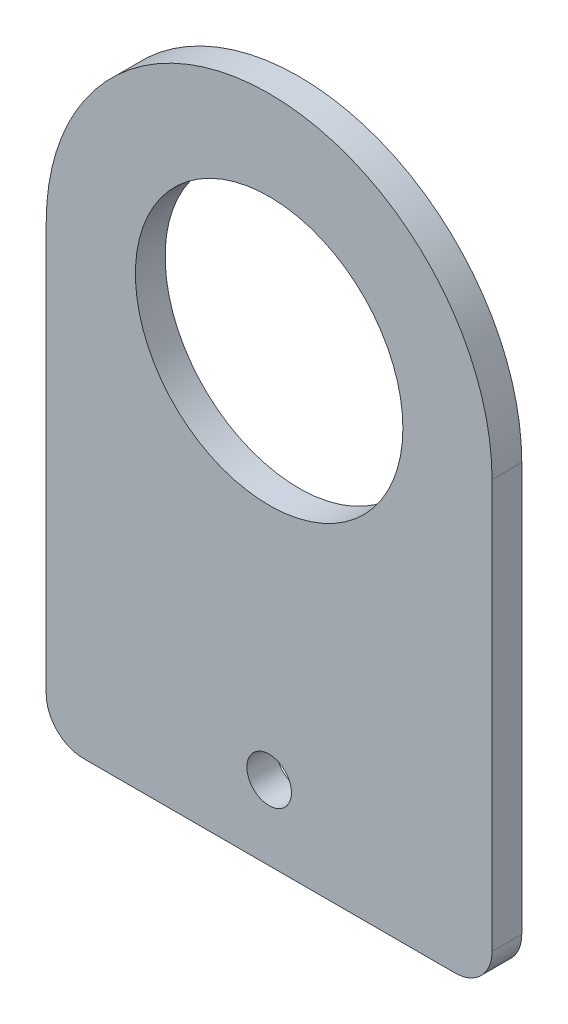
ISO-10303-21;
HEADER;
FILE_DESCRIPTION(('STEP AP214'),'2;1');
FILE_NAME('part.step','',(''),(''),'','','');
FILE_SCHEMA(('AUTOMOTIVE_DESIGN { 1 0 10303 214 1 1 1 1 }'));
ENDSEC;
DATA;
#1=APPLICATION_CONTEXT('core data for automotive mechanical design processes');
#2=APPLICATION_PROTOCOL_DEFINITION('international standard','automotive_design',2000,#1);
#3=PRODUCT_CONTEXT('',#1,'mechanical');
#4=PRODUCT('Part','Part','',(#3));
#5=PRODUCT_RELATED_PRODUCT_CATEGORY('part','',(#4));
#6=PRODUCT_DEFINITION_FORMATION('','',#4);
#7=PRODUCT_DEFINITION_CONTEXT('part definition',#1,'design');
#8=PRODUCT_DEFINITION('design','',#6,#7);
#9=PRODUCT_DEFINITION_SHAPE('','',#8);
#10=(LENGTH_UNIT() NAMED_UNIT(*) SI_UNIT(.MILLI.,.METRE.));
#11=(NAMED_UNIT(*) PLANE_ANGLE_UNIT() SI_UNIT($,.RADIAN.));
#12=(NAMED_UNIT(*) SI_UNIT($,.STERADIAN.) SOLID_ANGLE_UNIT());
#13=UNCERTAINTY_MEASURE_WITH_UNIT(LENGTH_MEASURE(1.E-05),#10,'distance_accuracy_value','');
#14=(GEOMETRIC_REPRESENTATION_CONTEXT(3) GLOBAL_UNCERTAINTY_ASSIGNED_CONTEXT((#13)) GLOBAL_UNIT_ASSIGNED_CONTEXT((#10,
#11,#12)) REPRESENTATION_CONTEXT('',''));
#15=CARTESIAN_POINT('',(0.,0.,0.));
#16=DIRECTION('',(0.,0.,1.));
#17=DIRECTION('',(1.,0.,0.));
#18=AXIS2_PLACEMENT_3D('',#15,#16,#17);
#19=CARTESIAN_POINT('',(90.50000188,94.49999896,2.));
#20=DIRECTION('',(0.,0.,1.));
#21=DIRECTION('',(1.,0.,0.));
#22=AXIS2_PLACEMENT_3D('',#19,#20,#21);
#23=PLANE('',#22);
#24=CARTESIAN_POINT('',(90.50000188,94.49999896,2.));
#25=DIRECTION('',(0.,0.,1.));
#26=DIRECTION('',(1.,0.,0.));
#27=AXIS2_PLACEMENT_3D('',#24,#25,#26);
#28=CIRCLE('',#27,8.99999978);
#29=CARTESIAN_POINT('',(99.50000166,94.49999896,2.));
#30=VERTEX_POINT('',#29);
#31=EDGE_CURVE('E125',#30,#30,#28,.T.);
#32=ORIENTED_EDGE('',*,*,#31,.F.);
#33=EDGE_LOOP('',(#32));
#34=FACE_BOUND('',#33,.T.);
#35=DIRECTION('',(0.,-1.,0.));
#36=VECTOR('',#35,1.);
#37=CARTESIAN_POINT('',(75.5000014,66.99999808,2.));
#38=LINE('',#37,#36);
#39=CARTESIAN_POINT('',(75.5000014,94.49999896,2.));
#40=VERTEX_POINT('',#39);
#41=CARTESIAN_POINT('',(75.5000014,66.99999808,2.));
#42=VERTEX_POINT('',#41);
#43=EDGE_CURVE('E50',#40,#42,#38,.T.);
#44=ORIENTED_EDGE('',*,*,#43,.T.);
#45=CARTESIAN_POINT('',(78.00000148,66.99999808,2.));
#46=DIRECTION('',(0.,0.,1.));
#47=DIRECTION('',(1.,0.,0.));
#48=AXIS2_PLACEMENT_3D('',#45,#46,#47);
#49=CIRCLE('',#48,2.50000008);
#50=CARTESIAN_POINT('',(78.00000148,64.499998,2.));
#51=VERTEX_POINT('',#50);
#52=EDGE_CURVE('E88',#42,#51,#49,.T.);
#53=ORIENTED_EDGE('',*,*,#52,.T.);
#54=DIRECTION('',(1.,0.,0.));
#55=VECTOR('',#54,1.);
#56=CARTESIAN_POINT('',(78.00000148,64.499998,2.));
#57=LINE('',#56,#55);
#58=CARTESIAN_POINT('',(103.00000228,64.499998,2.));
#59=VERTEX_POINT('',#58);
#60=EDGE_CURVE('E102',#51,#59,#57,.T.);
#61=ORIENTED_EDGE('',*,*,#60,.T.);
#62=CARTESIAN_POINT('',(103.00000228,66.99999808,2.));
#63=DIRECTION('',(0.,0.,1.));
#64=DIRECTION('',(1.,0.,0.));
#65=AXIS2_PLACEMENT_3D('',#62,#63,#64);
#66=CIRCLE('',#65,2.50000008);
#67=CARTESIAN_POINT('',(105.50000236,66.99999808,2.));
#68=VERTEX_POINT('',#67);
#69=EDGE_CURVE('E96',#59,#68,#66,.T.);
#70=ORIENTED_EDGE('',*,*,#69,.T.);
#71=DIRECTION('',(0.,1.,0.));
#72=VECTOR('',#71,1.);
#73=CARTESIAN_POINT('',(105.50000236,66.99999808,2.));
#74=LINE('',#73,#72);
#75=CARTESIAN_POINT('',(105.50000236,94.49999896,2.));
#76=VERTEX_POINT('',#75);
#77=EDGE_CURVE('E100',#68,#76,#74,.T.);
#78=ORIENTED_EDGE('',*,*,#77,.T.);
#79=CARTESIAN_POINT('',(90.50000188,94.49999896,2.));
#80=DIRECTION('',(0.,0.,1.));
#81=DIRECTION('',(1.,0.,0.));
#82=AXIS2_PLACEMENT_3D('',#79,#80,#81);
#83=CIRCLE('',#82,15.00000048);
#84=EDGE_CURVE('E116',#76,#40,#83,.T.);
#85=ORIENTED_EDGE('',*,*,#84,.T.);
#86=EDGE_LOOP('',(#44,#53,#61,#70,#78,#85));
#87=FACE_BOUND('',#86,.T.);
#88=CARTESIAN_POINT('',(90.50000188,69.49999816,2.));
#89=DIRECTION('',(0.,0.,1.));
#90=DIRECTION('',(1.,0.,0.));
#91=AXIS2_PLACEMENT_3D('',#88,#89,#90);
#92=CIRCLE('',#91,1.49999954000001);
#93=CARTESIAN_POINT('',(92.00000142,69.49999816,2.));
#94=VERTEX_POINT('',#93);
#95=EDGE_CURVE('E151',#94,#94,#92,.T.);
#96=ORIENTED_EDGE('',*,*,#95,.F.);
#97=EDGE_LOOP('',(#96));
#98=FACE_BOUND('',#97,.T.);
#99=ADVANCED_FACE('F33',(#34,#87,#98),#23,.T.);
#100=CARTESIAN_POINT('',(90.50000188,94.49999896,0.));
#101=DIRECTION('',(0.,0.,1.));
#102=DIRECTION('',(1.,0.,0.));
#103=AXIS2_PLACEMENT_3D('',#100,#101,#102);
#104=PLANE('',#103);
#105=CARTESIAN_POINT('',(78.00000148,66.99999808,0.));
#106=DIRECTION('',(0.,0.,1.));
#107=DIRECTION('',(1.,0.,0.));
#108=AXIS2_PLACEMENT_3D('',#105,#106,#107);
#109=CIRCLE('',#108,2.50000008);
#110=CARTESIAN_POINT('',(75.5000014,66.99999808,0.));
#111=VERTEX_POINT('',#110);
#112=CARTESIAN_POINT('',(78.00000148,64.499998,0.));
#113=VERTEX_POINT('',#112);
#114=EDGE_CURVE('E122',#111,#113,#109,.T.);
#115=ORIENTED_EDGE('',*,*,#114,.F.);
#116=DIRECTION('',(0.,-1.,0.));
#117=VECTOR('',#116,1.);
#118=CARTESIAN_POINT('',(75.5000014,79.49999848,0.));
#119=LINE('',#118,#117);
#120=CARTESIAN_POINT('',(75.5000014,94.49999896,0.));
#121=VERTEX_POINT('',#120);
#122=EDGE_CURVE('E130',#121,#111,#119,.T.);
#123=ORIENTED_EDGE('',*,*,#122,.F.);
#124=CARTESIAN_POINT('',(90.50000188,94.49999896,0.));
#125=DIRECTION('',(0.,0.,1.));
#126=DIRECTION('',(1.,0.,0.));
#127=AXIS2_PLACEMENT_3D('',#124,#125,#126);
#128=CIRCLE('',#127,15.00000048);
#129=CARTESIAN_POINT('',(105.50000236,94.49999896,0.));
#130=VERTEX_POINT('',#129);
#131=EDGE_CURVE('E81',#130,#121,#128,.T.);
#132=ORIENTED_EDGE('',*,*,#131,.F.);
#133=DIRECTION('',(0.,1.,0.));
#134=VECTOR('',#133,1.);
#135=CARTESIAN_POINT('',(105.50000236,66.99999808,0.));
#136=LINE('',#135,#134);
#137=CARTESIAN_POINT('',(105.50000236,66.99999808,0.));
#138=VERTEX_POINT('',#137);
#139=EDGE_CURVE('E74',#138,#130,#136,.T.);
#140=ORIENTED_EDGE('',*,*,#139,.F.);
#141=CARTESIAN_POINT('',(103.00000228,66.99999808,0.));
#142=DIRECTION('',(0.,0.,1.));
#143=DIRECTION('',(1.,0.,0.));
#144=AXIS2_PLACEMENT_3D('',#141,#142,#143);
#145=CIRCLE('',#144,2.50000008);
#146=CARTESIAN_POINT('',(103.00000228,64.499998,0.));
#147=VERTEX_POINT('',#146);
#148=EDGE_CURVE('E110',#147,#138,#145,.T.);
#149=ORIENTED_EDGE('',*,*,#148,.F.);
#150=DIRECTION('',(1.,0.,0.));
#151=VECTOR('',#150,1.);
#152=CARTESIAN_POINT('',(78.00000148,64.499998,0.));
#153=LINE('',#152,#151);
#154=EDGE_CURVE('E124',#113,#147,#153,.T.);
#155=ORIENTED_EDGE('',*,*,#154,.F.);
#156=EDGE_LOOP('',(#115,#123,#132,#140,#149,#155));
#157=FACE_BOUND('',#156,.T.);
#158=CARTESIAN_POINT('',(90.50000188,94.49999896,0.));
#159=DIRECTION('',(0.,0.,1.));
#160=DIRECTION('',(1.,0.,0.));
#161=AXIS2_PLACEMENT_3D('',#158,#159,#160);
#162=CIRCLE('',#161,8.99999978);
#163=CARTESIAN_POINT('',(99.50000166,94.49999896,0.));
#164=VERTEX_POINT('',#163);
#165=EDGE_CURVE('E148',#164,#164,#162,.T.);
#166=ORIENTED_EDGE('',*,*,#165,.T.);
#167=EDGE_LOOP('',(#166));
#168=FACE_BOUND('',#167,.T.);
#169=CARTESIAN_POINT('',(90.50000188,69.49999816,0.));
#170=DIRECTION('',(0.,0.,1.));
#171=DIRECTION('',(1.,0.,0.));
#172=AXIS2_PLACEMENT_3D('',#169,#170,#171);
#173=CIRCLE('',#172,1.49999954000001);
#174=CARTESIAN_POINT('',(92.00000142,69.49999816,0.));
#175=VERTEX_POINT('',#174);
#176=EDGE_CURVE('E154',#175,#175,#173,.T.);
#177=ORIENTED_EDGE('',*,*,#176,.T.);
#178=EDGE_LOOP('',(#177));
#179=FACE_BOUND('',#178,.T.);
#180=ADVANCED_FACE('F140',(#157,#168,#179),#104,.F.);
#181=CARTESIAN_POINT('',(78.00000148,66.99999808,2.));
#182=DIRECTION('',(0.,0.,-1.));
#183=DIRECTION('',(-1.,0.,0.));
#184=AXIS2_PLACEMENT_3D('',#181,#182,#183);
#185=CYLINDRICAL_SURFACE('',#184,2.50000008);
#186=ORIENTED_EDGE('',*,*,#114,.T.);
#187=DIRECTION('',(0.,0.,-1.));
#188=VECTOR('',#187,1.);
#189=CARTESIAN_POINT('',(78.00000148,64.499998,2.));
#190=LINE('',#189,#188);
#191=EDGE_CURVE('E42',#51,#113,#190,.T.);
#192=ORIENTED_EDGE('',*,*,#191,.F.);
#193=ORIENTED_EDGE('',*,*,#52,.F.);
#194=DIRECTION('',(0.,0.,-1.));
#195=VECTOR('',#194,1.);
#196=CARTESIAN_POINT('',(75.5000014,66.99999808,2.));
#197=LINE('',#196,#195);
#198=EDGE_CURVE('E11',#42,#111,#197,.T.);
#199=ORIENTED_EDGE('',*,*,#198,.T.);
#200=EDGE_LOOP('',(#186,#192,#193,#199));
#201=FACE_BOUND('',#200,.T.);
#202=ADVANCED_FACE('F35',(#201),#185,.T.);
#203=CARTESIAN_POINT('',(78.00000148,64.499998,2.));
#204=DIRECTION('',(0.,1.,0.));
#205=DIRECTION('',(0.,0.,1.));
#206=AXIS2_PLACEMENT_3D('',#203,#204,#205);
#207=PLANE('',#206);
#208=ORIENTED_EDGE('',*,*,#154,.T.);
#209=DIRECTION('',(0.,0.,-1.));
#210=VECTOR('',#209,1.);
#211=CARTESIAN_POINT('',(103.00000228,64.499998,2.));
#212=LINE('',#211,#210);
#213=EDGE_CURVE('E111',#59,#147,#212,.T.);
#214=ORIENTED_EDGE('',*,*,#213,.F.);
#215=ORIENTED_EDGE('',*,*,#60,.F.);
#216=ORIENTED_EDGE('',*,*,#191,.T.);
#217=EDGE_LOOP('',(#208,#214,#215,#216));
#218=FACE_BOUND('',#217,.T.);
#219=ADVANCED_FACE('F137',(#218),#207,.F.);
#220=CARTESIAN_POINT('',(103.00000228,66.99999808,2.));
#221=DIRECTION('',(0.,0.,-1.));
#222=DIRECTION('',(-1.,0.,0.));
#223=AXIS2_PLACEMENT_3D('',#220,#221,#222);
#224=CYLINDRICAL_SURFACE('',#223,2.50000008);
#225=ORIENTED_EDGE('',*,*,#148,.T.);
#226=DIRECTION('',(0.,0.,-1.));
#227=VECTOR('',#226,1.);
#228=CARTESIAN_POINT('',(105.50000236,66.99999808,2.));
#229=LINE('',#228,#227);
#230=EDGE_CURVE('E107',#68,#138,#229,.T.);
#231=ORIENTED_EDGE('',*,*,#230,.F.);
#232=ORIENTED_EDGE('',*,*,#69,.F.);
#233=ORIENTED_EDGE('',*,*,#213,.T.);
#234=EDGE_LOOP('',(#225,#231,#232,#233));
#235=FACE_BOUND('',#234,.T.);
#236=ADVANCED_FACE('F108',(#235),#224,.T.);
#237=CARTESIAN_POINT('',(105.50000236,66.99999808,2.));
#238=DIRECTION('',(-1.,0.,0.));
#239=DIRECTION('',(0.,0.,1.));
#240=AXIS2_PLACEMENT_3D('',#237,#238,#239);
#241=PLANE('',#240);
#242=ORIENTED_EDGE('',*,*,#139,.T.);
#243=DIRECTION('',(0.,0.,-1.));
#244=VECTOR('',#243,1.);
#245=CARTESIAN_POINT('',(105.50000236,94.49999896,2.));
#246=LINE('',#245,#244);
#247=EDGE_CURVE('E112',#76,#130,#246,.T.);
#248=ORIENTED_EDGE('',*,*,#247,.F.);
#249=ORIENTED_EDGE('',*,*,#77,.F.);
#250=ORIENTED_EDGE('',*,*,#230,.T.);
#251=EDGE_LOOP('',(#242,#248,#249,#250));
#252=FACE_BOUND('',#251,.T.);
#253=ADVANCED_FACE('F114',(#252),#241,.F.);
#254=CARTESIAN_POINT('',(90.50000188,94.49999896,2.));
#255=DIRECTION('',(0.,0.,-1.));
#256=DIRECTION('',(-1.,0.,0.));
#257=AXIS2_PLACEMENT_3D('',#254,#255,#256);
#258=CYLINDRICAL_SURFACE('',#257,15.00000048);
#259=ORIENTED_EDGE('',*,*,#131,.T.);
#260=DIRECTION('',(0.,0.,-1.));
#261=VECTOR('',#260,1.);
#262=CARTESIAN_POINT('',(75.5000014,94.49999896,2.));
#263=LINE('',#262,#261);
#264=EDGE_CURVE('E118',#40,#121,#263,.T.);
#265=ORIENTED_EDGE('',*,*,#264,.F.);
#266=ORIENTED_EDGE('',*,*,#84,.F.);
#267=ORIENTED_EDGE('',*,*,#247,.T.);
#268=EDGE_LOOP('',(#259,#265,#266,#267));
#269=FACE_BOUND('',#268,.T.);
#270=ADVANCED_FACE('F144',(#269),#258,.T.);
#271=CARTESIAN_POINT('',(75.5000014,79.49999848,2.));
#272=DIRECTION('',(1.,0.,0.));
#273=DIRECTION('',(0.,0.,-1.));
#274=AXIS2_PLACEMENT_3D('',#271,#272,#273);
#275=PLANE('',#274);
#276=ORIENTED_EDGE('',*,*,#122,.T.);
#277=ORIENTED_EDGE('',*,*,#198,.F.);
#278=ORIENTED_EDGE('',*,*,#43,.F.);
#279=ORIENTED_EDGE('',*,*,#264,.T.);
#280=EDGE_LOOP('',(#276,#277,#278,#279));
#281=FACE_BOUND('',#280,.T.);
#282=ADVANCED_FACE('F143',(#281),#275,.F.);
#283=CARTESIAN_POINT('',(90.50000188,94.49999896,2.));
#284=DIRECTION('',(0.,0.,-1.));
#285=DIRECTION('',(-1.,0.,0.));
#286=AXIS2_PLACEMENT_3D('',#283,#284,#285);
#287=CYLINDRICAL_SURFACE('',#286,8.99999978);
#288=ORIENTED_EDGE('',*,*,#31,.T.);
#289=EDGE_LOOP('',(#288));
#290=FACE_BOUND('',#289,.T.);
#291=ORIENTED_EDGE('',*,*,#165,.F.);
#292=EDGE_LOOP('',(#291));
#293=FACE_BOUND('',#292,.T.);
#294=ADVANCED_FACE('F171',(#290,#293),#287,.F.);
#295=CARTESIAN_POINT('',(90.50000188,69.49999816,2.));
#296=DIRECTION('',(0.,0.,-1.));
#297=DIRECTION('',(-1.,0.,0.));
#298=AXIS2_PLACEMENT_3D('',#295,#296,#297);
#299=CYLINDRICAL_SURFACE('',#298,1.49999954000001);
#300=ORIENTED_EDGE('',*,*,#95,.T.);
#301=EDGE_LOOP('',(#300));
#302=FACE_BOUND('',#301,.T.);
#303=ORIENTED_EDGE('',*,*,#176,.F.);
#304=EDGE_LOOP('',(#303));
#305=FACE_BOUND('',#304,.T.);
#306=ADVANCED_FACE('F160',(#302,#305),#299,.F.);
#307=CLOSED_SHELL('',(#99,#180,#202,#219,#236,#253,#270,#282,#294,#306));
#308=MANIFOLD_SOLID_BREP('B2',#307);
#309=ADVANCED_BREP_SHAPE_REPRESENTATION('',(#18,#308),#14);
#310=SHAPE_DEFINITION_REPRESENTATION(#9,#309);
ENDSEC;
END-ISO-10303-21;
